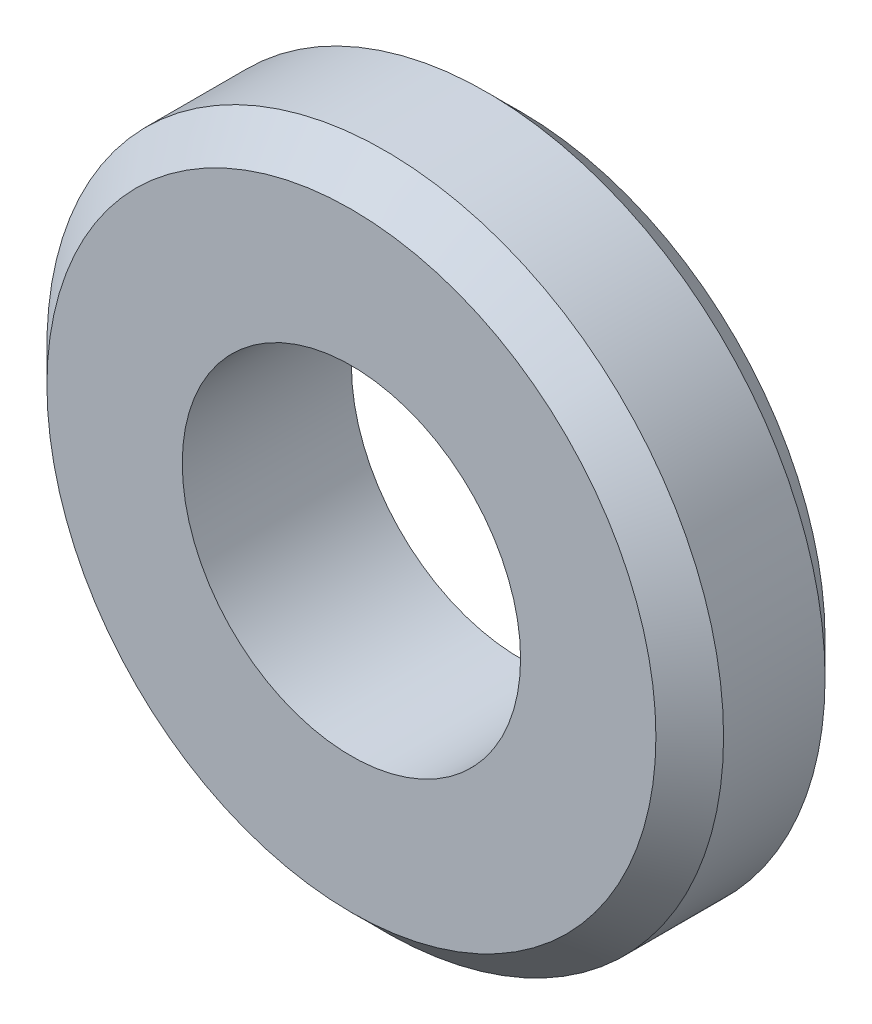
ISO-10303-21;
HEADER;
FILE_DESCRIPTION(('STEP AP214'),'2;1');
FILE_NAME('part.step','',(''),(''),'','','');
FILE_SCHEMA(('AUTOMOTIVE_DESIGN { 1 0 10303 214 1 1 1 1 }'));
ENDSEC;
DATA;
#1=APPLICATION_CONTEXT('core data for automotive mechanical design processes');
#2=APPLICATION_PROTOCOL_DEFINITION('international standard','automotive_design',2000,#1);
#3=PRODUCT_CONTEXT('',#1,'mechanical');
#4=PRODUCT('Part','Part','',(#3));
#5=PRODUCT_RELATED_PRODUCT_CATEGORY('part','',(#4));
#6=PRODUCT_DEFINITION_FORMATION('','',#4);
#7=PRODUCT_DEFINITION_CONTEXT('part definition',#1,'design');
#8=PRODUCT_DEFINITION('design','',#6,#7);
#9=PRODUCT_DEFINITION_SHAPE('','',#8);
#10=(LENGTH_UNIT() NAMED_UNIT(*) SI_UNIT(.MILLI.,.METRE.));
#11=(NAMED_UNIT(*) PLANE_ANGLE_UNIT() SI_UNIT($,.RADIAN.));
#12=(NAMED_UNIT(*) SI_UNIT($,.STERADIAN.) SOLID_ANGLE_UNIT());
#13=UNCERTAINTY_MEASURE_WITH_UNIT(LENGTH_MEASURE(1.E-05),#10,'distance_accuracy_value','');
#14=(GEOMETRIC_REPRESENTATION_CONTEXT(3) GLOBAL_UNCERTAINTY_ASSIGNED_CONTEXT((#13)) GLOBAL_UNIT_ASSIGNED_CONTEXT((#10,
#11,#12)) REPRESENTATION_CONTEXT('',''));
#15=CARTESIAN_POINT('',(0.,0.,0.));
#16=DIRECTION('',(0.,0.,1.));
#17=DIRECTION('',(1.,0.,0.));
#18=AXIS2_PLACEMENT_3D('',#15,#16,#17);
#19=CARTESIAN_POINT('',(0.,0.,0.9748375));
#20=DIRECTION('',(0.,0.,1.));
#21=DIRECTION('',(1.,0.,0.));
#22=AXIS2_PLACEMENT_3D('',#19,#20,#21);
#23=PLANE('',#22);
#24=CARTESIAN_POINT('',(0.,0.,0.9748375));
#25=DIRECTION('',(0.,0.,1.));
#26=DIRECTION('',(1.,0.,0.));
#27=AXIS2_PLACEMENT_3D('',#24,#25,#26);
#28=CIRCLE('',#27,2.609415);
#29=CARTESIAN_POINT('',(2.609415,0.,0.9748375));
#30=VERTEX_POINT('',#29);
#31=EDGE_CURVE('E10',#30,#30,#28,.T.);
#32=ORIENTED_EDGE('',*,*,#31,.T.);
#33=EDGE_LOOP('',(#32));
#34=FACE_BOUND('',#33,.T.);
#35=CARTESIAN_POINT('',(0.,0.,0.9748375));
#36=DIRECTION('',(0.,0.,1.));
#37=DIRECTION('',(1.,0.,0.));
#38=AXIS2_PLACEMENT_3D('',#35,#36,#37);
#39=CIRCLE('',#38,1.449675);
#40=CARTESIAN_POINT('',(1.449675,0.,0.9748375));
#41=VERTEX_POINT('',#40);
#42=EDGE_CURVE('E52',#41,#41,#39,.T.);
#43=ORIENTED_EDGE('',*,*,#42,.F.);
#44=EDGE_LOOP('',(#43));
#45=FACE_BOUND('',#44,.T.);
#46=ADVANCED_FACE('F32',(#34,#45),#23,.T.);
#47=CARTESIAN_POINT('',(0.,0.,-0.4748375));
#48=DIRECTION('',(0.,0.,1.));
#49=DIRECTION('',(1.,0.,0.));
#50=AXIS2_PLACEMENT_3D('',#47,#48,#49);
#51=PLANE('',#50);
#52=CARTESIAN_POINT('',(0.,0.,-0.4748375));
#53=DIRECTION('',(0.,0.,1.));
#54=DIRECTION('',(1.,0.,0.));
#55=AXIS2_PLACEMENT_3D('',#52,#53,#54);
#56=CIRCLE('',#55,2.609415);
#57=CARTESIAN_POINT('',(2.609415,0.,-0.4748375));
#58=VERTEX_POINT('',#57);
#59=EDGE_CURVE('E39',#58,#58,#56,.F.);
#60=ORIENTED_EDGE('',*,*,#59,.T.);
#61=EDGE_LOOP('',(#60));
#62=FACE_BOUND('',#61,.T.);
#63=CARTESIAN_POINT('',(0.,0.,-0.4748375));
#64=DIRECTION('',(0.,0.,1.));
#65=DIRECTION('',(1.,0.,0.));
#66=AXIS2_PLACEMENT_3D('',#63,#64,#65);
#67=CIRCLE('',#66,1.449675);
#68=CARTESIAN_POINT('',(1.449675,0.,-0.4748375));
#69=VERTEX_POINT('',#68);
#70=EDGE_CURVE('E53',#69,#69,#67,.T.);
#71=ORIENTED_EDGE('',*,*,#70,.T.);
#72=EDGE_LOOP('',(#71));
#73=FACE_BOUND('',#72,.T.);
#74=ADVANCED_FACE('F63',(#62,#73),#51,.F.);
#75=CARTESIAN_POINT('',(0.,0.,0.9748375));
#76=DIRECTION('',(0.,0.,-1.));
#77=DIRECTION('',(-1.,0.,0.));
#78=AXIS2_PLACEMENT_3D('',#75,#76,#77);
#79=CYLINDRICAL_SURFACE('',#78,2.89935);
#80=CARTESIAN_POINT('',(0.,0.,-0.184902499999999));
#81=DIRECTION('',(0.,0.,1.));
#82=DIRECTION('',(1.,0.,0.));
#83=AXIS2_PLACEMENT_3D('',#80,#81,#82);
#84=CIRCLE('',#83,2.89935);
#85=CARTESIAN_POINT('',(2.89935,0.,-0.184902499999999));
#86=VERTEX_POINT('',#85);
#87=EDGE_CURVE('E43',#86,#86,#84,.T.);
#88=ORIENTED_EDGE('',*,*,#87,.T.);
#89=EDGE_LOOP('',(#88));
#90=FACE_BOUND('',#89,.T.);
#91=CARTESIAN_POINT('',(0.,0.,0.684902499999998));
#92=DIRECTION('',(0.,0.,1.));
#93=DIRECTION('',(1.,0.,0.));
#94=AXIS2_PLACEMENT_3D('',#91,#92,#93);
#95=CIRCLE('',#94,2.89935);
#96=CARTESIAN_POINT('',(2.89935,0.,0.684902499999998));
#97=VERTEX_POINT('',#96);
#98=EDGE_CURVE('E47',#97,#97,#95,.F.);
#99=ORIENTED_EDGE('',*,*,#98,.T.);
#100=EDGE_LOOP('',(#99));
#101=FACE_BOUND('',#100,.T.);
#102=ADVANCED_FACE('F68',(#90,#101),#79,.T.);
#103=CARTESIAN_POINT('',(0.,0.,0.9748375));
#104=DIRECTION('',(0.,0.,-1.));
#105=DIRECTION('',(-1.,0.,0.));
#106=AXIS2_PLACEMENT_3D('',#103,#104,#105);
#107=CYLINDRICAL_SURFACE('',#106,1.449675);
#108=ORIENTED_EDGE('',*,*,#42,.T.);
#109=EDGE_LOOP('',(#108));
#110=FACE_BOUND('',#109,.T.);
#111=ORIENTED_EDGE('',*,*,#70,.F.);
#112=EDGE_LOOP('',(#111));
#113=FACE_BOUND('',#112,.T.);
#114=ADVANCED_FACE('F59',(#110,#113),#107,.F.);
#115=CARTESIAN_POINT('',(0.,0.,-0.184902499999999));
#116=DIRECTION('',(0.,0.,1.));
#117=DIRECTION('',(1.,0.,0.));
#118=AXIS2_PLACEMENT_3D('',#115,#116,#117);
#119=CONICAL_SURFACE('',#118,2.89935,0.78539816339745);
#120=ORIENTED_EDGE('',*,*,#59,.F.);
#121=EDGE_LOOP('',(#120));
#122=FACE_BOUND('',#121,.T.);
#123=ORIENTED_EDGE('',*,*,#87,.F.);
#124=EDGE_LOOP('',(#123));
#125=FACE_BOUND('',#124,.T.);
#126=ADVANCED_FACE('F74',(#122,#125),#119,.T.);
#127=CARTESIAN_POINT('',(0.,0.,0.9748375));
#128=DIRECTION('',(0.,0.,-1.));
#129=DIRECTION('',(-1.,0.,0.));
#130=AXIS2_PLACEMENT_3D('',#127,#128,#129);
#131=CONICAL_SURFACE('',#130,2.609415,0.785398163397446);
#132=ORIENTED_EDGE('',*,*,#98,.F.);
#133=EDGE_LOOP('',(#132));
#134=FACE_BOUND('',#133,.T.);
#135=ORIENTED_EDGE('',*,*,#31,.F.);
#136=EDGE_LOOP('',(#135));
#137=FACE_BOUND('',#136,.T.);
#138=ADVANCED_FACE('F34',(#134,#137),#131,.T.);
#139=CLOSED_SHELL('',(#46,#74,#102,#114,#126,#138));
#140=MANIFOLD_SOLID_BREP('B2',#139);
#141=ADVANCED_BREP_SHAPE_REPRESENTATION('',(#18,#140),#14);
#142=SHAPE_DEFINITION_REPRESENTATION(#9,#141);
ENDSEC;
END-ISO-10303-21;
